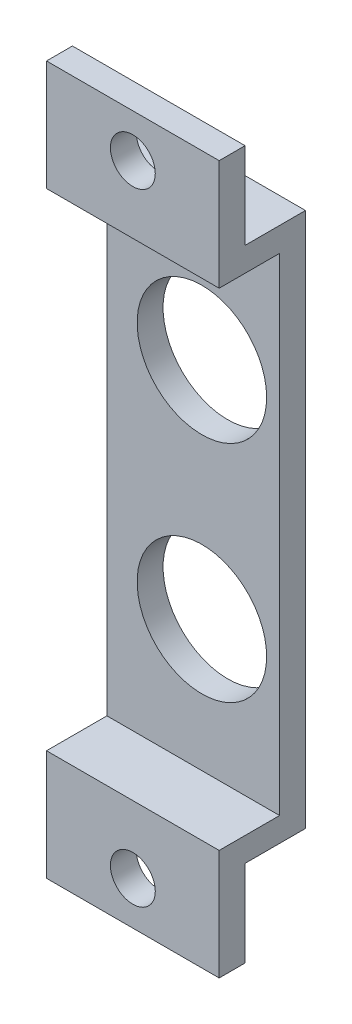
ISO-10303-21;
HEADER;
FILE_DESCRIPTION(('STEP AP214'),'2;1');
FILE_NAME('part.step','',(''),(''),'','','');
FILE_SCHEMA(('AUTOMOTIVE_DESIGN { 1 0 10303 214 1 1 1 1 }'));
ENDSEC;
DATA;
#1=APPLICATION_CONTEXT('core data for automotive mechanical design processes');
#2=APPLICATION_PROTOCOL_DEFINITION('international standard','automotive_design',2000,#1);
#3=PRODUCT_CONTEXT('',#1,'mechanical');
#4=PRODUCT('Part','Part','',(#3));
#5=PRODUCT_RELATED_PRODUCT_CATEGORY('part','',(#4));
#6=PRODUCT_DEFINITION_FORMATION('','',#4);
#7=PRODUCT_DEFINITION_CONTEXT('part definition',#1,'design');
#8=PRODUCT_DEFINITION('design','',#6,#7);
#9=PRODUCT_DEFINITION_SHAPE('','',#8);
#10=(LENGTH_UNIT() NAMED_UNIT(*) SI_UNIT(.MILLI.,.METRE.));
#11=(NAMED_UNIT(*) PLANE_ANGLE_UNIT() SI_UNIT($,.RADIAN.));
#12=(NAMED_UNIT(*) SI_UNIT($,.STERADIAN.) SOLID_ANGLE_UNIT());
#13=UNCERTAINTY_MEASURE_WITH_UNIT(LENGTH_MEASURE(1.E-05),#10,'distance_accuracy_value','');
#14=(GEOMETRIC_REPRESENTATION_CONTEXT(3) GLOBAL_UNCERTAINTY_ASSIGNED_CONTEXT((#13)) GLOBAL_UNIT_ASSIGNED_CONTEXT((#10,
#11,#12)) REPRESENTATION_CONTEXT('',''));
#15=CARTESIAN_POINT('',(0.,0.,0.));
#16=DIRECTION('',(0.,0.,1.));
#17=DIRECTION('',(1.,0.,0.));
#18=AXIS2_PLACEMENT_3D('',#15,#16,#17);
#19=CARTESIAN_POINT('',(-9.99999999999999,-31.,-10.));
#20=DIRECTION('',(0.,-1.,0.));
#21=DIRECTION('',(0.,0.,-1.));
#22=AXIS2_PLACEMENT_3D('',#19,#20,#21);
#23=PLANE('',#22);
#24=DIRECTION('',(0.,0.,1.));
#25=VECTOR('',#24,1.);
#26=CARTESIAN_POINT('',(10.,-31.,-10.));
#27=LINE('',#26,#25);
#28=CARTESIAN_POINT('',(10.,-31.,-10.));
#29=VERTEX_POINT('',#28);
#30=CARTESIAN_POINT('',(10.,-31.,-3.));
#31=VERTEX_POINT('',#30);
#32=EDGE_CURVE('E199',#29,#31,#27,.T.);
#33=ORIENTED_EDGE('',*,*,#32,.T.);
#34=DIRECTION('',(-1.,0.,0.));
#35=VECTOR('',#34,1.);
#36=CARTESIAN_POINT('',(0.,-31.,-3.));
#37=LINE('',#36,#35);
#38=CARTESIAN_POINT('',(-9.99999999999999,-31.,-3.));
#39=VERTEX_POINT('',#38);
#40=EDGE_CURVE('E146',#31,#39,#37,.T.);
#41=ORIENTED_EDGE('',*,*,#40,.T.);
#42=DIRECTION('',(0.,0.,1.));
#43=VECTOR('',#42,1.);
#44=CARTESIAN_POINT('',(-9.99999999999999,-31.,-10.));
#45=LINE('',#44,#43);
#46=CARTESIAN_POINT('',(-9.99999999999999,-31.,-10.));
#47=VERTEX_POINT('',#46);
#48=EDGE_CURVE('E145',#47,#39,#45,.T.);
#49=ORIENTED_EDGE('',*,*,#48,.F.);
#50=DIRECTION('',(1.,0.,0.));
#51=VECTOR('',#50,1.);
#52=CARTESIAN_POINT('',(-9.99999999999999,-31.,-10.));
#53=LINE('',#52,#51);
#54=EDGE_CURVE('E187',#47,#29,#53,.T.);
#55=ORIENTED_EDGE('',*,*,#54,.T.);
#56=EDGE_LOOP('',(#33,#41,#49,#55));
#57=FACE_BOUND('',#56,.T.);
#58=ADVANCED_FACE('F36',(#57),#23,.T.);
#59=CARTESIAN_POINT('',(0.,0.,-7.));
#60=DIRECTION('',(0.,0.,1.));
#61=DIRECTION('',(1.,0.,0.));
#62=AXIS2_PLACEMENT_3D('',#59,#60,#61);
#63=PLANE('',#62);
#64=CARTESIAN_POINT('',(1.00000000000001,13.,-7.));
#65=DIRECTION('',(0.,0.,1.));
#66=DIRECTION('',(1.,0.,0.));
#67=AXIS2_PLACEMENT_3D('',#64,#65,#66);
#68=CIRCLE('',#67,7.5);
#69=CARTESIAN_POINT('',(8.5,13.,-7.));
#70=VERTEX_POINT('',#69);
#71=EDGE_CURVE('E176',#70,#70,#68,.T.);
#72=ORIENTED_EDGE('',*,*,#71,.F.);
#73=EDGE_LOOP('',(#72));
#74=FACE_BOUND('',#73,.T.);
#75=CARTESIAN_POINT('',(1.00000000000001,-13.,-7.));
#76=DIRECTION('',(0.,0.,1.));
#77=DIRECTION('',(1.,0.,0.));
#78=AXIS2_PLACEMENT_3D('',#75,#76,#77);
#79=CIRCLE('',#78,7.5);
#80=CARTESIAN_POINT('',(8.50000000000001,-13.,-7.));
#81=VERTEX_POINT('',#80);
#82=EDGE_CURVE('E172',#81,#81,#79,.T.);
#83=ORIENTED_EDGE('',*,*,#82,.F.);
#84=EDGE_LOOP('',(#83));
#85=FACE_BOUND('',#84,.T.);
#86=DIRECTION('',(0.,-1.,0.));
#87=VECTOR('',#86,1.);
#88=CARTESIAN_POINT('',(-9.99999999999999,31.,-7.));
#89=LINE('',#88,#87);
#90=CARTESIAN_POINT('',(-9.99999999999999,28.2,-7.));
#91=VERTEX_POINT('',#90);
#92=CARTESIAN_POINT('',(-9.99999999999999,-28.2,-7.));
#93=VERTEX_POINT('',#92);
#94=EDGE_CURVE('E182',#91,#93,#89,.T.);
#95=ORIENTED_EDGE('',*,*,#94,.T.);
#96=DIRECTION('',(-1.,0.,0.));
#97=VECTOR('',#96,1.);
#98=CARTESIAN_POINT('',(10.,-28.2,-7.));
#99=LINE('',#98,#97);
#100=CARTESIAN_POINT('',(10.,-28.2,-7.));
#101=VERTEX_POINT('',#100);
#102=EDGE_CURVE('E59',#101,#93,#99,.T.);
#103=ORIENTED_EDGE('',*,*,#102,.F.);
#104=DIRECTION('',(0.,1.,0.));
#105=VECTOR('',#104,1.);
#106=CARTESIAN_POINT('',(10.,31.,-7.));
#107=LINE('',#106,#105);
#108=CARTESIAN_POINT('',(10.,28.2,-7.));
#109=VERTEX_POINT('',#108);
#110=EDGE_CURVE('E188',#101,#109,#107,.T.);
#111=ORIENTED_EDGE('',*,*,#110,.T.);
#112=DIRECTION('',(1.,0.,0.));
#113=VECTOR('',#112,1.);
#114=CARTESIAN_POINT('',(-9.99999999999999,28.2,-7.));
#115=LINE('',#114,#113);
#116=EDGE_CURVE('E202',#91,#109,#115,.T.);
#117=ORIENTED_EDGE('',*,*,#116,.F.);
#118=EDGE_LOOP('',(#95,#103,#111,#117));
#119=FACE_BOUND('',#118,.T.);
#120=ADVANCED_FACE('F271',(#74,#85,#119),#63,.T.);
#121=CARTESIAN_POINT('',(-10.,0.,-3.));
#122=DIRECTION('',(1.,0.,0.));
#123=DIRECTION('',(0.,0.,-1.));
#124=AXIS2_PLACEMENT_3D('',#121,#122,#123);
#125=PLANE('',#124);
#126=DIRECTION('',(0.,1.,0.));
#127=VECTOR('',#126,1.);
#128=CARTESIAN_POINT('',(-10.,0.,0.));
#129=LINE('',#128,#127);
#130=CARTESIAN_POINT('',(-9.99999999999999,28.2,0.));
#131=VERTEX_POINT('',#130);
#132=CARTESIAN_POINT('',(-10.,41.,0.));
#133=VERTEX_POINT('',#132);
#134=EDGE_CURVE('E224',#131,#133,#129,.T.);
#135=ORIENTED_EDGE('',*,*,#134,.T.);
#136=DIRECTION('',(0.,0.,1.));
#137=VECTOR('',#136,1.);
#138=CARTESIAN_POINT('',(-10.,41.,-3.));
#139=LINE('',#138,#137);
#140=CARTESIAN_POINT('',(-10.,41.,-3.));
#141=VERTEX_POINT('',#140);
#142=EDGE_CURVE('E11',#141,#133,#139,.T.);
#143=ORIENTED_EDGE('',*,*,#142,.F.);
#144=DIRECTION('',(0.,1.,0.));
#145=VECTOR('',#144,1.);
#146=CARTESIAN_POINT('',(-10.,0.,-3.));
#147=LINE('',#146,#145);
#148=CARTESIAN_POINT('',(-10.,31.,-3.));
#149=VERTEX_POINT('',#148);
#150=EDGE_CURVE('E232',#149,#141,#147,.T.);
#151=ORIENTED_EDGE('',*,*,#150,.F.);
#152=DIRECTION('',(0.,0.,-1.));
#153=VECTOR('',#152,1.);
#154=CARTESIAN_POINT('',(-10.,31.,0.));
#155=LINE('',#154,#153);
#156=CARTESIAN_POINT('',(-9.99999999999999,31.,-10.));
#157=VERTEX_POINT('',#156);
#158=EDGE_CURVE('E207',#149,#157,#155,.T.);
#159=ORIENTED_EDGE('',*,*,#158,.T.);
#160=DIRECTION('',(0.,-1.,0.));
#161=VECTOR('',#160,1.);
#162=CARTESIAN_POINT('',(-9.99999999999999,31.,-10.));
#163=LINE('',#162,#161);
#164=EDGE_CURVE('E185',#157,#47,#163,.T.);
#165=ORIENTED_EDGE('',*,*,#164,.T.);
#166=ORIENTED_EDGE('',*,*,#48,.T.);
#167=DIRECTION('',(0.,-1.,0.));
#168=VECTOR('',#167,1.);
#169=CARTESIAN_POINT('',(-9.99999999999999,0.,-3.));
#170=LINE('',#169,#168);
#171=CARTESIAN_POINT('',(-9.99999999999999,-41.,-3.));
#172=VERTEX_POINT('',#171);
#173=EDGE_CURVE('E51',#39,#172,#170,.T.);
#174=ORIENTED_EDGE('',*,*,#173,.T.);
#175=DIRECTION('',(0.,0.,1.));
#176=VECTOR('',#175,1.);
#177=CARTESIAN_POINT('',(-9.99999999999999,-41.,-3.));
#178=LINE('',#177,#176);
#179=CARTESIAN_POINT('',(-9.99999999999999,-41.,0.));
#180=VERTEX_POINT('',#179);
#181=EDGE_CURVE('E134',#172,#180,#178,.T.);
#182=ORIENTED_EDGE('',*,*,#181,.T.);
#183=DIRECTION('',(0.,-1.,0.));
#184=VECTOR('',#183,1.);
#185=CARTESIAN_POINT('',(-9.99999999999999,-31.,0.));
#186=LINE('',#185,#184);
#187=CARTESIAN_POINT('',(-9.99999999999999,-28.2,0.));
#188=VERTEX_POINT('',#187);
#189=EDGE_CURVE('E163',#188,#180,#186,.T.);
#190=ORIENTED_EDGE('',*,*,#189,.F.);
#191=DIRECTION('',(0.,0.,-1.));
#192=VECTOR('',#191,1.);
#193=CARTESIAN_POINT('',(-9.99999999999999,-28.2,0.));
#194=LINE('',#193,#192);
#195=EDGE_CURVE('E165',#188,#93,#194,.T.);
#196=ORIENTED_EDGE('',*,*,#195,.T.);
#197=ORIENTED_EDGE('',*,*,#94,.F.);
#198=DIRECTION('',(0.,0.,-1.));
#199=VECTOR('',#198,1.);
#200=CARTESIAN_POINT('',(-9.99999999999999,28.2,0.));
#201=LINE('',#200,#199);
#202=EDGE_CURVE('E216',#131,#91,#201,.T.);
#203=ORIENTED_EDGE('',*,*,#202,.F.);
#204=EDGE_LOOP('',(#135,#143,#151,#159,#165,#166,#174,#182,#190,#196,#197,#203));
#205=FACE_BOUND('',#204,.T.);
#206=ADVANCED_FACE('F143',(#205),#125,.F.);
#207=CARTESIAN_POINT('',(0.,41.,-3.));
#208=DIRECTION('',(0.,-1.,0.));
#209=DIRECTION('',(0.,0.,-1.));
#210=AXIS2_PLACEMENT_3D('',#207,#208,#209);
#211=PLANE('',#210);
#212=DIRECTION('',(1.,0.,0.));
#213=VECTOR('',#212,1.);
#214=CARTESIAN_POINT('',(0.,41.,0.));
#215=LINE('',#214,#213);
#216=CARTESIAN_POINT('',(10.,41.,0.));
#217=VERTEX_POINT('',#216);
#218=EDGE_CURVE('E239',#133,#217,#215,.T.);
#219=ORIENTED_EDGE('',*,*,#218,.T.);
#220=DIRECTION('',(0.,0.,1.));
#221=VECTOR('',#220,1.);
#222=CARTESIAN_POINT('',(10.,41.,-3.));
#223=LINE('',#222,#221);
#224=CARTESIAN_POINT('',(10.,41.,-3.));
#225=VERTEX_POINT('',#224);
#226=EDGE_CURVE('E40',#225,#217,#223,.T.);
#227=ORIENTED_EDGE('',*,*,#226,.F.);
#228=DIRECTION('',(1.,0.,0.));
#229=VECTOR('',#228,1.);
#230=CARTESIAN_POINT('',(0.,41.,-3.));
#231=LINE('',#230,#229);
#232=EDGE_CURVE('E230',#141,#225,#231,.T.);
#233=ORIENTED_EDGE('',*,*,#232,.F.);
#234=ORIENTED_EDGE('',*,*,#142,.T.);
#235=EDGE_LOOP('',(#219,#227,#233,#234));
#236=FACE_BOUND('',#235,.T.);
#237=ADVANCED_FACE('F251',(#236),#211,.F.);
#238=CARTESIAN_POINT('',(0.,36.,-3.));
#239=DIRECTION('',(0.,0.,1.));
#240=DIRECTION('',(1.,0.,0.));
#241=AXIS2_PLACEMENT_3D('',#238,#239,#240);
#242=CYLINDRICAL_SURFACE('',#241,2.6);
#243=CARTESIAN_POINT('',(0.,36.,-3.));
#244=DIRECTION('',(0.,0.,1.));
#245=DIRECTION('',(1.,0.,0.));
#246=AXIS2_PLACEMENT_3D('',#243,#244,#245);
#247=CIRCLE('',#246,2.6);
#248=CARTESIAN_POINT('',(2.6,36.,-3.));
#249=VERTEX_POINT('',#248);
#250=EDGE_CURVE('E220',#249,#249,#247,.T.);
#251=ORIENTED_EDGE('',*,*,#250,.F.);
#252=EDGE_LOOP('',(#251));
#253=FACE_BOUND('',#252,.T.);
#254=CARTESIAN_POINT('',(0.,36.,0.));
#255=DIRECTION('',(0.,0.,1.));
#256=DIRECTION('',(1.,0.,0.));
#257=AXIS2_PLACEMENT_3D('',#254,#255,#256);
#258=CIRCLE('',#257,2.6);
#259=CARTESIAN_POINT('',(2.6,36.,0.));
#260=VERTEX_POINT('',#259);
#261=EDGE_CURVE('E219',#260,#260,#258,.T.);
#262=ORIENTED_EDGE('',*,*,#261,.T.);
#263=EDGE_LOOP('',(#262));
#264=FACE_BOUND('',#263,.T.);
#265=ADVANCED_FACE('F38',(#253,#264),#242,.F.);
#266=CARTESIAN_POINT('',(10.,0.,-3.));
#267=DIRECTION('',(1.,0.,0.));
#268=DIRECTION('',(0.,0.,-1.));
#269=AXIS2_PLACEMENT_3D('',#266,#267,#268);
#270=PLANE('',#269);
#271=DIRECTION('',(0.,1.,0.));
#272=VECTOR('',#271,1.);
#273=CARTESIAN_POINT('',(10.,0.,0.));
#274=LINE('',#273,#272);
#275=CARTESIAN_POINT('',(10.,28.2,0.));
#276=VERTEX_POINT('',#275);
#277=EDGE_CURVE('E236',#276,#217,#274,.T.);
#278=ORIENTED_EDGE('',*,*,#277,.F.);
#279=DIRECTION('',(0.,0.,-1.));
#280=VECTOR('',#279,1.);
#281=CARTESIAN_POINT('',(10.,28.2,0.));
#282=LINE('',#281,#280);
#283=EDGE_CURVE('E213',#276,#109,#282,.T.);
#284=ORIENTED_EDGE('',*,*,#283,.T.);
#285=ORIENTED_EDGE('',*,*,#110,.F.);
#286=DIRECTION('',(0.,0.,-1.));
#287=VECTOR('',#286,1.);
#288=CARTESIAN_POINT('',(10.,-28.2,0.));
#289=LINE('',#288,#287);
#290=CARTESIAN_POINT('',(10.,-28.2,0.));
#291=VERTEX_POINT('',#290);
#292=EDGE_CURVE('E169',#291,#101,#289,.T.);
#293=ORIENTED_EDGE('',*,*,#292,.F.);
#294=DIRECTION('',(0.,1.,0.));
#295=VECTOR('',#294,1.);
#296=CARTESIAN_POINT('',(10.,-31.,0.));
#297=LINE('',#296,#295);
#298=CARTESIAN_POINT('',(10.,-41.,0.));
#299=VERTEX_POINT('',#298);
#300=EDGE_CURVE('E158',#299,#291,#297,.T.);
#301=ORIENTED_EDGE('',*,*,#300,.F.);
#302=DIRECTION('',(0.,0.,1.));
#303=VECTOR('',#302,1.);
#304=CARTESIAN_POINT('',(10.,-41.,-3.));
#305=LINE('',#304,#303);
#306=CARTESIAN_POINT('',(10.,-41.,-3.));
#307=VERTEX_POINT('',#306);
#308=EDGE_CURVE('E140',#307,#299,#305,.T.);
#309=ORIENTED_EDGE('',*,*,#308,.F.);
#310=DIRECTION('',(0.,-1.,0.));
#311=VECTOR('',#310,1.);
#312=CARTESIAN_POINT('',(10.,0.,-3.));
#313=LINE('',#312,#311);
#314=EDGE_CURVE('E127',#31,#307,#313,.T.);
#315=ORIENTED_EDGE('',*,*,#314,.F.);
#316=ORIENTED_EDGE('',*,*,#32,.F.);
#317=DIRECTION('',(0.,1.,0.));
#318=VECTOR('',#317,1.);
#319=CARTESIAN_POINT('',(10.,31.,-10.));
#320=LINE('',#319,#318);
#321=CARTESIAN_POINT('',(10.,31.,-10.));
#322=VERTEX_POINT('',#321);
#323=EDGE_CURVE('E191',#29,#322,#320,.T.);
#324=ORIENTED_EDGE('',*,*,#323,.T.);
#325=DIRECTION('',(0.,0.,-1.));
#326=VECTOR('',#325,1.);
#327=CARTESIAN_POINT('',(10.,31.,0.));
#328=LINE('',#327,#326);
#329=CARTESIAN_POINT('',(10.,31.,-3.));
#330=VERTEX_POINT('',#329);
#331=EDGE_CURVE('E211',#330,#322,#328,.T.);
#332=ORIENTED_EDGE('',*,*,#331,.F.);
#333=DIRECTION('',(0.,1.,0.));
#334=VECTOR('',#333,1.);
#335=CARTESIAN_POINT('',(10.,0.,-3.));
#336=LINE('',#335,#334);
#337=EDGE_CURVE('E227',#330,#225,#336,.T.);
#338=ORIENTED_EDGE('',*,*,#337,.T.);
#339=ORIENTED_EDGE('',*,*,#226,.T.);
#340=EDGE_LOOP('',(#278,#284,#285,#293,#301,#309,#315,#316,#324,#332,#338,#339));
#341=FACE_BOUND('',#340,.T.);
#342=ADVANCED_FACE('F256',(#341),#270,.T.);
#343=CARTESIAN_POINT('',(0.,0.,-3.));
#344=DIRECTION('',(0.,0.,1.));
#345=DIRECTION('',(1.,0.,0.));
#346=AXIS2_PLACEMENT_3D('',#343,#344,#345);
#347=PLANE('',#346);
#348=ORIENTED_EDGE('',*,*,#250,.T.);
#349=EDGE_LOOP('',(#348));
#350=FACE_BOUND('',#349,.T.);
#351=DIRECTION('',(-1.,0.,0.));
#352=VECTOR('',#351,1.);
#353=CARTESIAN_POINT('',(0.,31.,-3.));
#354=LINE('',#353,#352);
#355=EDGE_CURVE('E223',#330,#149,#354,.T.);
#356=ORIENTED_EDGE('',*,*,#355,.T.);
#357=ORIENTED_EDGE('',*,*,#150,.T.);
#358=ORIENTED_EDGE('',*,*,#232,.T.);
#359=ORIENTED_EDGE('',*,*,#337,.F.);
#360=EDGE_LOOP('',(#356,#357,#358,#359));
#361=FACE_BOUND('',#360,.T.);
#362=ADVANCED_FACE('F260',(#350,#361),#347,.F.);
#363=CARTESIAN_POINT('',(0.,0.,0.));
#364=DIRECTION('',(0.,0.,1.));
#365=DIRECTION('',(1.,0.,0.));
#366=AXIS2_PLACEMENT_3D('',#363,#364,#365);
#367=PLANE('',#366);
#368=ORIENTED_EDGE('',*,*,#261,.F.);
#369=EDGE_LOOP('',(#368));
#370=FACE_BOUND('',#369,.T.);
#371=ORIENTED_EDGE('',*,*,#134,.F.);
#372=DIRECTION('',(1.,0.,0.));
#373=VECTOR('',#372,1.);
#374=CARTESIAN_POINT('',(-9.99999999999999,28.2,0.));
#375=LINE('',#374,#373);
#376=EDGE_CURVE('E204',#131,#276,#375,.T.);
#377=ORIENTED_EDGE('',*,*,#376,.T.);
#378=ORIENTED_EDGE('',*,*,#277,.T.);
#379=ORIENTED_EDGE('',*,*,#218,.F.);
#380=EDGE_LOOP('',(#371,#377,#378,#379));
#381=FACE_BOUND('',#380,.T.);
#382=ADVANCED_FACE('F253',(#370,#381),#367,.T.);
#383=CARTESIAN_POINT('',(-9.99999999999999,28.2,0.));
#384=DIRECTION('',(0.,1.,0.));
#385=DIRECTION('',(0.,0.,1.));
#386=AXIS2_PLACEMENT_3D('',#383,#384,#385);
#387=PLANE('',#386);
#388=ORIENTED_EDGE('',*,*,#116,.T.);
#389=ORIENTED_EDGE('',*,*,#283,.F.);
#390=ORIENTED_EDGE('',*,*,#376,.F.);
#391=ORIENTED_EDGE('',*,*,#202,.T.);
#392=EDGE_LOOP('',(#388,#389,#390,#391));
#393=FACE_BOUND('',#392,.T.);
#394=ADVANCED_FACE('F282',(#393),#387,.F.);
#395=CARTESIAN_POINT('',(-10.,31.,0.));
#396=DIRECTION('',(0.,-1.,0.));
#397=DIRECTION('',(0.,0.,-1.));
#398=AXIS2_PLACEMENT_3D('',#395,#396,#397);
#399=PLANE('',#398);
#400=ORIENTED_EDGE('',*,*,#355,.F.);
#401=ORIENTED_EDGE('',*,*,#331,.T.);
#402=DIRECTION('',(-1.,0.,0.));
#403=VECTOR('',#402,1.);
#404=CARTESIAN_POINT('',(-9.99999999999999,31.,-10.));
#405=LINE('',#404,#403);
#406=EDGE_CURVE('E194',#322,#157,#405,.T.);
#407=ORIENTED_EDGE('',*,*,#406,.T.);
#408=ORIENTED_EDGE('',*,*,#158,.F.);
#409=EDGE_LOOP('',(#400,#401,#407,#408));
#410=FACE_BOUND('',#409,.T.);
#411=ADVANCED_FACE('F268',(#410),#399,.F.);
#412=CARTESIAN_POINT('',(0.,0.,-10.));
#413=DIRECTION('',(0.,0.,1.));
#414=DIRECTION('',(1.,0.,0.));
#415=AXIS2_PLACEMENT_3D('',#412,#413,#414);
#416=PLANE('',#415);
#417=CARTESIAN_POINT('',(1.00000000000001,-13.,-10.));
#418=DIRECTION('',(0.,0.,1.));
#419=DIRECTION('',(1.,0.,0.));
#420=AXIS2_PLACEMENT_3D('',#417,#418,#419);
#421=CIRCLE('',#420,7.5);
#422=CARTESIAN_POINT('',(8.50000000000001,-13.,-10.));
#423=VERTEX_POINT('',#422);
#424=EDGE_CURVE('E173',#423,#423,#421,.T.);
#425=ORIENTED_EDGE('',*,*,#424,.T.);
#426=EDGE_LOOP('',(#425));
#427=FACE_BOUND('',#426,.T.);
#428=CARTESIAN_POINT('',(1.00000000000001,13.,-10.));
#429=DIRECTION('',(0.,0.,1.));
#430=DIRECTION('',(1.,0.,0.));
#431=AXIS2_PLACEMENT_3D('',#428,#429,#430);
#432=CIRCLE('',#431,7.5);
#433=CARTESIAN_POINT('',(8.5,13.,-10.));
#434=VERTEX_POINT('',#433);
#435=EDGE_CURVE('E179',#434,#434,#432,.T.);
#436=ORIENTED_EDGE('',*,*,#435,.T.);
#437=EDGE_LOOP('',(#436));
#438=FACE_BOUND('',#437,.T.);
#439=ORIENTED_EDGE('',*,*,#164,.F.);
#440=ORIENTED_EDGE('',*,*,#406,.F.);
#441=ORIENTED_EDGE('',*,*,#323,.F.);
#442=ORIENTED_EDGE('',*,*,#54,.F.);
#443=EDGE_LOOP('',(#439,#440,#441,#442));
#444=FACE_BOUND('',#443,.T.);
#445=ADVANCED_FACE('F266',(#427,#438,#444),#416,.F.);
#446=CARTESIAN_POINT('',(1.00000000000001,13.,-10.));
#447=DIRECTION('',(0.,0.,1.));
#448=DIRECTION('',(1.,0.,0.));
#449=AXIS2_PLACEMENT_3D('',#446,#447,#448);
#450=CYLINDRICAL_SURFACE('',#449,7.5);
#451=ORIENTED_EDGE('',*,*,#435,.F.);
#452=EDGE_LOOP('',(#451));
#453=FACE_BOUND('',#452,.T.);
#454=ORIENTED_EDGE('',*,*,#71,.T.);
#455=EDGE_LOOP('',(#454));
#456=FACE_BOUND('',#455,.T.);
#457=ADVANCED_FACE('F428',(#453,#456),#450,.F.);
#458=CARTESIAN_POINT('',(1.00000000000001,-13.,-10.));
#459=DIRECTION('',(0.,0.,1.));
#460=DIRECTION('',(1.,0.,0.));
#461=AXIS2_PLACEMENT_3D('',#458,#459,#460);
#462=CYLINDRICAL_SURFACE('',#461,7.5);
#463=ORIENTED_EDGE('',*,*,#424,.F.);
#464=EDGE_LOOP('',(#463));
#465=FACE_BOUND('',#464,.T.);
#466=ORIENTED_EDGE('',*,*,#82,.T.);
#467=EDGE_LOOP('',(#466));
#468=FACE_BOUND('',#467,.T.);
#469=ADVANCED_FACE('F384',(#465,#468),#462,.F.);
#470=CARTESIAN_POINT('',(10.,-28.2,0.));
#471=DIRECTION('',(0.,-1.,0.));
#472=DIRECTION('',(0.,0.,-1.));
#473=AXIS2_PLACEMENT_3D('',#470,#471,#472);
#474=PLANE('',#473);
#475=ORIENTED_EDGE('',*,*,#102,.T.);
#476=ORIENTED_EDGE('',*,*,#195,.F.);
#477=DIRECTION('',(-1.,0.,0.));
#478=VECTOR('',#477,1.);
#479=CARTESIAN_POINT('',(10.,-28.2,0.));
#480=LINE('',#479,#478);
#481=EDGE_CURVE('E161',#291,#188,#480,.T.);
#482=ORIENTED_EDGE('',*,*,#481,.F.);
#483=ORIENTED_EDGE('',*,*,#292,.T.);
#484=EDGE_LOOP('',(#475,#476,#482,#483));
#485=FACE_BOUND('',#484,.T.);
#486=ADVANCED_FACE('F377',(#485),#474,.F.);
#487=CARTESIAN_POINT('',(0.,0.,0.));
#488=DIRECTION('',(0.,0.,1.));
#489=DIRECTION('',(1.,0.,0.));
#490=AXIS2_PLACEMENT_3D('',#487,#488,#489);
#491=PLANE('',#490);
#492=ORIENTED_EDGE('',*,*,#300,.T.);
#493=ORIENTED_EDGE('',*,*,#481,.T.);
#494=ORIENTED_EDGE('',*,*,#189,.T.);
#495=DIRECTION('',(-1.,0.,0.));
#496=VECTOR('',#495,1.);
#497=CARTESIAN_POINT('',(0.,-41.,0.));
#498=LINE('',#497,#496);
#499=EDGE_CURVE('E137',#299,#180,#498,.T.);
#500=ORIENTED_EDGE('',*,*,#499,.F.);
#501=EDGE_LOOP('',(#492,#493,#494,#500));
#502=FACE_BOUND('',#501,.T.);
#503=CARTESIAN_POINT('',(0.,-36.,0.));
#504=DIRECTION('',(0.,0.,1.));
#505=DIRECTION('',(1.,0.,0.));
#506=AXIS2_PLACEMENT_3D('',#503,#504,#505);
#507=CIRCLE('',#506,2.6);
#508=CARTESIAN_POINT('',(2.60000000000001,-36.,0.));
#509=VERTEX_POINT('',#508);
#510=EDGE_CURVE('E153',#509,#509,#507,.T.);
#511=ORIENTED_EDGE('',*,*,#510,.F.);
#512=EDGE_LOOP('',(#511));
#513=FACE_BOUND('',#512,.T.);
#514=ADVANCED_FACE('F383',(#502,#513),#491,.T.);
#515=CARTESIAN_POINT('',(0.,-41.,-3.));
#516=DIRECTION('',(0.,1.,0.));
#517=DIRECTION('',(0.,0.,1.));
#518=AXIS2_PLACEMENT_3D('',#515,#516,#517);
#519=PLANE('',#518);
#520=ORIENTED_EDGE('',*,*,#499,.T.);
#521=ORIENTED_EDGE('',*,*,#181,.F.);
#522=DIRECTION('',(-1.,0.,0.));
#523=VECTOR('',#522,1.);
#524=CARTESIAN_POINT('',(0.,-41.,-3.));
#525=LINE('',#524,#523);
#526=EDGE_CURVE('E124',#307,#172,#525,.T.);
#527=ORIENTED_EDGE('',*,*,#526,.F.);
#528=ORIENTED_EDGE('',*,*,#308,.T.);
#529=EDGE_LOOP('',(#520,#521,#527,#528));
#530=FACE_BOUND('',#529,.T.);
#531=ADVANCED_FACE('F135',(#530),#519,.F.);
#532=CARTESIAN_POINT('',(0.,-36.,-3.));
#533=DIRECTION('',(0.,0.,1.));
#534=DIRECTION('',(1.,0.,0.));
#535=AXIS2_PLACEMENT_3D('',#532,#533,#534);
#536=CYLINDRICAL_SURFACE('',#535,2.6);
#537=CARTESIAN_POINT('',(0.,-36.,-3.));
#538=DIRECTION('',(0.,0.,1.));
#539=DIRECTION('',(1.,0.,0.));
#540=AXIS2_PLACEMENT_3D('',#537,#538,#539);
#541=CIRCLE('',#540,2.6);
#542=CARTESIAN_POINT('',(2.60000000000001,-36.,-3.));
#543=VERTEX_POINT('',#542);
#544=EDGE_CURVE('E148',#543,#543,#541,.T.);
#545=ORIENTED_EDGE('',*,*,#544,.F.);
#546=EDGE_LOOP('',(#545));
#547=FACE_BOUND('',#546,.T.);
#548=ORIENTED_EDGE('',*,*,#510,.T.);
#549=EDGE_LOOP('',(#548));
#550=FACE_BOUND('',#549,.T.);
#551=ADVANCED_FACE('F403',(#547,#550),#536,.F.);
#552=CARTESIAN_POINT('',(0.,0.,-3.));
#553=DIRECTION('',(0.,0.,1.));
#554=DIRECTION('',(1.,0.,0.));
#555=AXIS2_PLACEMENT_3D('',#552,#553,#554);
#556=PLANE('',#555);
#557=ORIENTED_EDGE('',*,*,#544,.T.);
#558=EDGE_LOOP('',(#557));
#559=FACE_BOUND('',#558,.T.);
#560=ORIENTED_EDGE('',*,*,#40,.F.);
#561=ORIENTED_EDGE('',*,*,#314,.T.);
#562=ORIENTED_EDGE('',*,*,#526,.T.);
#563=ORIENTED_EDGE('',*,*,#173,.F.);
#564=EDGE_LOOP('',(#560,#561,#562,#563));
#565=FACE_BOUND('',#564,.T.);
#566=ADVANCED_FACE('F126',(#559,#565),#556,.F.);
#567=CLOSED_SHELL('',(#58,#120,#206,#237,#265,#342,#362,#382,#394,#411,#445,#457,#469,#486,#514,
#531,#551,#566));
#568=MANIFOLD_SOLID_BREP('B2',#567);
#569=ADVANCED_BREP_SHAPE_REPRESENTATION('',(#18,#568),#14);
#570=SHAPE_DEFINITION_REPRESENTATION(#9,#569);
ENDSEC;
END-ISO-10303-21;
